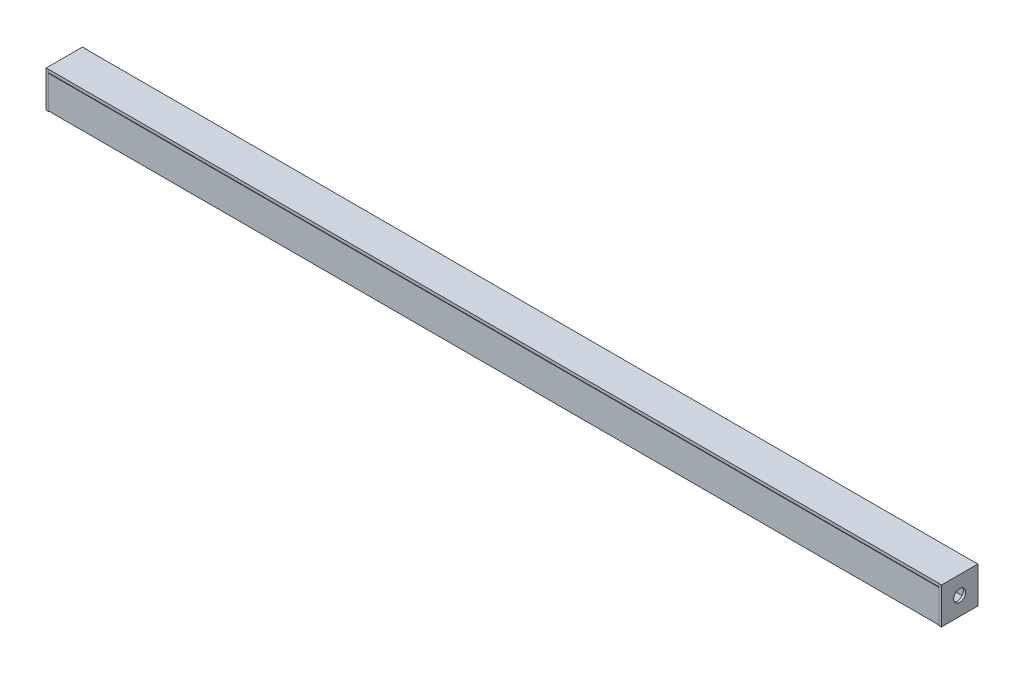
ISO-10303-21;
HEADER;
FILE_DESCRIPTION(('STEP AP214'),'2;1');
FILE_NAME('part.step','',(''),(''),'','','');
FILE_SCHEMA(('AUTOMOTIVE_DESIGN { 1 0 10303 214 1 1 1 1 }'));
ENDSEC;
DATA;
#1=APPLICATION_CONTEXT('core data for automotive mechanical design processes');
#2=APPLICATION_PROTOCOL_DEFINITION('international standard','automotive_design',2000,#1);
#3=PRODUCT_CONTEXT('',#1,'mechanical');
#4=PRODUCT('Part','Part','',(#3));
#5=PRODUCT_RELATED_PRODUCT_CATEGORY('part','',(#4));
#6=PRODUCT_DEFINITION_FORMATION('','',#4);
#7=PRODUCT_DEFINITION_CONTEXT('part definition',#1,'design');
#8=PRODUCT_DEFINITION('design','',#6,#7);
#9=PRODUCT_DEFINITION_SHAPE('','',#8);
#10=(LENGTH_UNIT() NAMED_UNIT(*) SI_UNIT(.MILLI.,.METRE.));
#11=(NAMED_UNIT(*) PLANE_ANGLE_UNIT() SI_UNIT($,.RADIAN.));
#12=(NAMED_UNIT(*) SI_UNIT($,.STERADIAN.) SOLID_ANGLE_UNIT());
#13=UNCERTAINTY_MEASURE_WITH_UNIT(LENGTH_MEASURE(1.E-05),#10,'distance_accuracy_value','');
#14=(GEOMETRIC_REPRESENTATION_CONTEXT(3) GLOBAL_UNCERTAINTY_ASSIGNED_CONTEXT((#13)) GLOBAL_UNIT_ASSIGNED_CONTEXT((#10,
#11,#12)) REPRESENTATION_CONTEXT('',''));
#15=CARTESIAN_POINT('',(0.,0.,0.));
#16=DIRECTION('',(0.,0.,1.));
#17=DIRECTION('',(1.,0.,0.));
#18=AXIS2_PLACEMENT_3D('',#15,#16,#17);
#19=CARTESIAN_POINT('',(372.,16.9427678417194,24.2571428571429));
#20=DIRECTION('',(0.,0.,-1.));
#21=DIRECTION('',(-1.,0.,0.));
#22=AXIS2_PLACEMENT_3D('',#19,#20,#21);
#23=PLANE('',#22);
#24=DIRECTION('',(0.,-1.,0.));
#25=VECTOR('',#24,1.);
#26=CARTESIAN_POINT('',(371.,16.9427678417194,24.2571428571429));
#27=LINE('',#26,#25);
#28=CARTESIAN_POINT('',(371.,16.9427678417194,24.2571428571429));
#29=VERTEX_POINT('',#28);
#30=CARTESIAN_POINT('',(371.,15.6881507608121,24.2571428571429));
#31=VERTEX_POINT('',#30);
#32=EDGE_CURVE('E359',#29,#31,#27,.T.);
#33=ORIENTED_EDGE('',*,*,#32,.F.);
#34=DIRECTION('',(-1.,0.,0.));
#35=VECTOR('',#34,1.);
#36=CARTESIAN_POINT('',(372.,16.9427678417194,24.2571428571429));
#37=LINE('',#36,#35);
#38=CARTESIAN_POINT('',(1.,16.9427678417194,24.2571428571429));
#39=VERTEX_POINT('',#38);
#40=EDGE_CURVE('E475',#29,#39,#37,.T.);
#41=ORIENTED_EDGE('',*,*,#40,.T.);
#42=DIRECTION('',(0.,1.,0.));
#43=VECTOR('',#42,1.);
#44=CARTESIAN_POINT('',(1.,16.9427678417194,24.2571428571429));
#45=LINE('',#44,#43);
#46=CARTESIAN_POINT('',(1.,15.6881507608121,24.2571428571429));
#47=VERTEX_POINT('',#46);
#48=EDGE_CURVE('E407',#47,#39,#45,.T.);
#49=ORIENTED_EDGE('',*,*,#48,.F.);
#50=DIRECTION('',(1.,0.,0.));
#51=VECTOR('',#50,1.);
#52=CARTESIAN_POINT('',(0.,15.6881507608121,24.2571428571429));
#53=LINE('',#52,#51);
#54=EDGE_CURVE('E471',#47,#31,#53,.T.);
#55=ORIENTED_EDGE('',*,*,#54,.T.);
#56=EDGE_LOOP('',(#33,#41,#49,#55));
#57=FACE_BOUND('',#56,.T.);
#58=ADVANCED_FACE('F39',(#57),#23,.F.);
#59=CARTESIAN_POINT('',(372.,16.9427678417194,9.25714285714286));
#60=DIRECTION('',(0.,0.,1.));
#61=DIRECTION('',(0.,-1.,0.));
#62=AXIS2_PLACEMENT_3D('',#59,#60,#61);
#63=PLANE('',#62);
#64=DIRECTION('',(0.,1.,0.));
#65=VECTOR('',#64,1.);
#66=CARTESIAN_POINT('',(371.,16.9427678417194,9.25714285714286));
#67=LINE('',#66,#65);
#68=CARTESIAN_POINT('',(371.,1.94276784171945,9.25714285714286));
#69=VERTEX_POINT('',#68);
#70=CARTESIAN_POINT('',(371.,15.4881507608121,9.25714285714286));
#71=VERTEX_POINT('',#70);
#72=EDGE_CURVE('E369',#69,#71,#67,.T.);
#73=ORIENTED_EDGE('',*,*,#72,.F.);
#74=DIRECTION('',(-1.,0.,0.));
#75=VECTOR('',#74,1.);
#76=CARTESIAN_POINT('',(372.,1.94276784171945,9.25714285714286));
#77=LINE('',#76,#75);
#78=CARTESIAN_POINT('',(1.,1.94276784171945,9.25714285714286));
#79=VERTEX_POINT('',#78);
#80=EDGE_CURVE('E47',#69,#79,#77,.T.);
#81=ORIENTED_EDGE('',*,*,#80,.T.);
#82=DIRECTION('',(0.,-1.,0.));
#83=VECTOR('',#82,1.);
#84=CARTESIAN_POINT('',(1.,16.9427678417194,9.25714285714286));
#85=LINE('',#84,#83);
#86=CARTESIAN_POINT('',(1.,15.4881507608121,9.25714285714286));
#87=VERTEX_POINT('',#86);
#88=EDGE_CURVE('E397',#87,#79,#85,.T.);
#89=ORIENTED_EDGE('',*,*,#88,.F.);
#90=DIRECTION('',(1.,0.,0.));
#91=VECTOR('',#90,1.);
#92=CARTESIAN_POINT('',(0.,15.4881507608121,9.25714285714286));
#93=LINE('',#92,#91);
#94=EDGE_CURVE('E488',#87,#71,#93,.T.);
#95=ORIENTED_EDGE('',*,*,#94,.T.);
#96=EDGE_LOOP('',(#73,#81,#89,#95));
#97=FACE_BOUND('',#96,.T.);
#98=ADVANCED_FACE('F510',(#97),#63,.F.);
#99=CARTESIAN_POINT('',(371.,15.4881507608121,24.2571428571429));
#100=VERTEX_POINT('',#99);
#101=CARTESIAN_POINT('',(371.,1.94276784171945,24.2571428571429));
#102=VERTEX_POINT('',#101);
#103=EDGE_CURVE('E348',#100,#102,#27,.T.);
#104=ORIENTED_EDGE('',*,*,#103,.F.);
#105=DIRECTION('',(1.,0.,0.));
#106=VECTOR('',#105,1.);
#107=CARTESIAN_POINT('',(0.,15.4881507608121,24.2571428571429));
#108=LINE('',#107,#106);
#109=CARTESIAN_POINT('',(1.,15.4881507608121,24.2571428571429));
#110=VERTEX_POINT('',#109);
#111=EDGE_CURVE('E484',#110,#100,#108,.T.);
#112=ORIENTED_EDGE('',*,*,#111,.F.);
#113=CARTESIAN_POINT('',(1.,1.94276784171945,24.2571428571429));
#114=VERTEX_POINT('',#113);
#115=EDGE_CURVE('E408',#114,#110,#45,.T.);
#116=ORIENTED_EDGE('',*,*,#115,.F.);
#117=DIRECTION('',(-1.,0.,0.));
#118=VECTOR('',#117,1.);
#119=CARTESIAN_POINT('',(372.,1.94276784171945,24.2571428571429));
#120=LINE('',#119,#118);
#121=EDGE_CURVE('E11',#102,#114,#120,.T.);
#122=ORIENTED_EDGE('',*,*,#121,.F.);
#123=EDGE_LOOP('',(#104,#112,#116,#122));
#124=FACE_BOUND('',#123,.T.);
#125=ADVANCED_FACE('F595',(#124),#23,.F.);
#126=CARTESIAN_POINT('',(372.,1.94276784171945,24.2571428571429));
#127=DIRECTION('',(0.,1.,0.));
#128=DIRECTION('',(0.,0.,1.));
#129=AXIS2_PLACEMENT_3D('',#126,#127,#128);
#130=PLANE('',#129);
#131=DIRECTION('',(0.,0.,-1.));
#132=VECTOR('',#131,1.);
#133=CARTESIAN_POINT('',(371.,1.94276784171945,24.2571428571429));
#134=LINE('',#133,#132);
#135=CARTESIAN_POINT('',(371.,1.94276784171945,23.2571428571429));
#136=VERTEX_POINT('',#135);
#137=EDGE_CURVE('E364',#102,#136,#134,.T.);
#138=ORIENTED_EDGE('',*,*,#137,.F.);
#139=ORIENTED_EDGE('',*,*,#121,.T.);
#140=DIRECTION('',(0.,0.,1.));
#141=VECTOR('',#140,1.);
#142=CARTESIAN_POINT('',(1.,1.94276784171945,9.25714285714286));
#143=LINE('',#142,#141);
#144=CARTESIAN_POINT('',(1.,1.94276784171945,23.2571428571429));
#145=VERTEX_POINT('',#144);
#146=EDGE_CURVE('E402',#145,#114,#143,.T.);
#147=ORIENTED_EDGE('',*,*,#146,.F.);
#148=DIRECTION('',(-1.,0.,0.));
#149=VECTOR('',#148,1.);
#150=CARTESIAN_POINT('',(1.,1.94276784171945,23.2571428571429));
#151=LINE('',#150,#149);
#152=EDGE_CURVE('E442',#136,#145,#151,.T.);
#153=ORIENTED_EDGE('',*,*,#152,.F.);
#154=EDGE_LOOP('',(#138,#139,#147,#153));
#155=FACE_BOUND('',#154,.T.);
#156=ADVANCED_FACE('F589',(#155),#130,.F.);
#157=CARTESIAN_POINT('',(371.,1.94276784171945,10.2571428571429));
#158=VERTEX_POINT('',#157);
#159=EDGE_CURVE('E363',#158,#69,#134,.T.);
#160=ORIENTED_EDGE('',*,*,#159,.F.);
#161=DIRECTION('',(1.,0.,0.));
#162=VECTOR('',#161,1.);
#163=CARTESIAN_POINT('',(1.,1.94276784171945,10.2571428571429));
#164=LINE('',#163,#162);
#165=CARTESIAN_POINT('',(1.,1.94276784171945,10.2571428571429));
#166=VERTEX_POINT('',#165);
#167=EDGE_CURVE('E436',#166,#158,#164,.T.);
#168=ORIENTED_EDGE('',*,*,#167,.F.);
#169=EDGE_CURVE('E403',#79,#166,#143,.T.);
#170=ORIENTED_EDGE('',*,*,#169,.F.);
#171=ORIENTED_EDGE('',*,*,#80,.F.);
#172=EDGE_LOOP('',(#160,#168,#170,#171));
#173=FACE_BOUND('',#172,.T.);
#174=ADVANCED_FACE('F516',(#173),#130,.F.);
#175=CARTESIAN_POINT('',(371.,15.6881507608121,9.25714285714286));
#176=VERTEX_POINT('',#175);
#177=CARTESIAN_POINT('',(371.,16.9427678417194,9.25714285714286));
#178=VERTEX_POINT('',#177);
#179=EDGE_CURVE('E368',#176,#178,#67,.T.);
#180=ORIENTED_EDGE('',*,*,#179,.F.);
#181=DIRECTION('',(1.,0.,0.));
#182=VECTOR('',#181,1.);
#183=CARTESIAN_POINT('',(0.,15.6881507608121,9.25714285714286));
#184=LINE('',#183,#182);
#185=CARTESIAN_POINT('',(1.,15.6881507608121,9.25714285714286));
#186=VERTEX_POINT('',#185);
#187=EDGE_CURVE('E461',#186,#176,#184,.T.);
#188=ORIENTED_EDGE('',*,*,#187,.F.);
#189=CARTESIAN_POINT('',(1.,16.9427678417194,9.25714285714286));
#190=VERTEX_POINT('',#189);
#191=EDGE_CURVE('E398',#190,#186,#85,.T.);
#192=ORIENTED_EDGE('',*,*,#191,.F.);
#193=DIRECTION('',(-1.,0.,0.));
#194=VECTOR('',#193,1.);
#195=CARTESIAN_POINT('',(372.,16.9427678417194,9.25714285714286));
#196=LINE('',#195,#194);
#197=EDGE_CURVE('E504',#178,#190,#196,.T.);
#198=ORIENTED_EDGE('',*,*,#197,.F.);
#199=EDGE_LOOP('',(#180,#188,#192,#198));
#200=FACE_BOUND('',#199,.T.);
#201=ADVANCED_FACE('F556',(#200),#63,.F.);
#202=CARTESIAN_POINT('',(372.,16.9427678417194,24.2571428571429));
#203=DIRECTION('',(0.,-1.,0.));
#204=DIRECTION('',(0.,0.,-1.));
#205=AXIS2_PLACEMENT_3D('',#202,#203,#204);
#206=PLANE('',#205);
#207=ORIENTED_EDGE('',*,*,#40,.F.);
#208=DIRECTION('',(0.,0.,1.));
#209=VECTOR('',#208,1.);
#210=CARTESIAN_POINT('',(371.,16.9427678417194,24.3571428571429));
#211=LINE('',#210,#209);
#212=CARTESIAN_POINT('',(371.,16.9427678417194,24.3571428571429));
#213=VERTEX_POINT('',#212);
#214=EDGE_CURVE('E294',#29,#213,#211,.T.);
#215=ORIENTED_EDGE('',*,*,#214,.T.);
#216=DIRECTION('',(-1.,0.,0.));
#217=VECTOR('',#216,1.);
#218=CARTESIAN_POINT('',(372.,16.9427678417194,24.3571428571429));
#219=LINE('',#218,#217);
#220=CARTESIAN_POINT('',(372.,16.9427678417194,24.3571428571429));
#221=VERTEX_POINT('',#220);
#222=EDGE_CURVE('E284',#221,#213,#219,.T.);
#223=ORIENTED_EDGE('',*,*,#222,.F.);
#224=DIRECTION('',(0.,0.,1.));
#225=VECTOR('',#224,1.);
#226=CARTESIAN_POINT('',(372.,16.9427678417194,24.3571428571429));
#227=LINE('',#226,#225);
#228=CARTESIAN_POINT('',(372.,16.9427678417194,9.15714285714286));
#229=VERTEX_POINT('',#228);
#230=EDGE_CURVE('E281',#229,#221,#227,.T.);
#231=ORIENTED_EDGE('',*,*,#230,.F.);
#232=DIRECTION('',(-1.,0.,0.));
#233=VECTOR('',#232,1.);
#234=CARTESIAN_POINT('',(372.,16.9427678417194,9.15714285714286));
#235=LINE('',#234,#233);
#236=CARTESIAN_POINT('',(371.,16.9427678417194,9.15714285714286));
#237=VERTEX_POINT('',#236);
#238=EDGE_CURVE('E301',#229,#237,#235,.T.);
#239=ORIENTED_EDGE('',*,*,#238,.T.);
#240=EDGE_CURVE('E275',#237,#178,#211,.T.);
#241=ORIENTED_EDGE('',*,*,#240,.T.);
#242=ORIENTED_EDGE('',*,*,#197,.T.);
#243=DIRECTION('',(0.,0.,-1.));
#244=VECTOR('',#243,1.);
#245=CARTESIAN_POINT('',(1.,16.9427678417194,9.15714285714286));
#246=LINE('',#245,#244);
#247=CARTESIAN_POINT('',(1.,16.9427678417194,9.15714285714286));
#248=VERTEX_POINT('',#247);
#249=EDGE_CURVE('E562',#190,#248,#246,.T.);
#250=ORIENTED_EDGE('',*,*,#249,.T.);
#251=DIRECTION('',(1.,0.,0.));
#252=VECTOR('',#251,1.);
#253=CARTESIAN_POINT('',(0.,16.9427678417194,9.15714285714286));
#254=LINE('',#253,#252);
#255=CARTESIAN_POINT('',(0.,16.9427678417194,9.15714285714286));
#256=VERTEX_POINT('',#255);
#257=EDGE_CURVE('E572',#256,#248,#254,.T.);
#258=ORIENTED_EDGE('',*,*,#257,.F.);
#259=DIRECTION('',(0.,0.,-1.));
#260=VECTOR('',#259,1.);
#261=CARTESIAN_POINT('',(0.,16.9427678417194,9.15714285714286));
#262=LINE('',#261,#260);
#263=CARTESIAN_POINT('',(0.,16.9427678417194,24.3571428571429));
#264=VERTEX_POINT('',#263);
#265=EDGE_CURVE('E244',#264,#256,#262,.T.);
#266=ORIENTED_EDGE('',*,*,#265,.F.);
#267=DIRECTION('',(1.,0.,0.));
#268=VECTOR('',#267,1.);
#269=CARTESIAN_POINT('',(0.,16.9427678417194,24.3571428571429));
#270=LINE('',#269,#268);
#271=CARTESIAN_POINT('',(1.,16.9427678417194,24.3571428571429));
#272=VERTEX_POINT('',#271);
#273=EDGE_CURVE('E262',#264,#272,#270,.T.);
#274=ORIENTED_EDGE('',*,*,#273,.T.);
#275=EDGE_CURVE('E249',#272,#39,#246,.T.);
#276=ORIENTED_EDGE('',*,*,#275,.T.);
#277=EDGE_LOOP('',(#207,#215,#223,#231,#239,#241,#242,#250,#258,#266,#274,#276));
#278=FACE_BOUND('',#277,.T.);
#279=ADVANCED_FACE('F533',(#278),#206,.F.);
#280=CARTESIAN_POINT('',(0.,15.4881507608121,9.25714285714286));
#281=DIRECTION('',(0.,-1.,0.));
#282=DIRECTION('',(0.,0.,-1.));
#283=AXIS2_PLACEMENT_3D('',#280,#281,#282);
#284=PLANE('',#283);
#285=DIRECTION('',(0.,0.,1.));
#286=VECTOR('',#285,1.);
#287=CARTESIAN_POINT('',(371.,15.4881507608121,9.25714285714286));
#288=LINE('',#287,#286);
#289=CARTESIAN_POINT('',(371.,15.4881507608121,9.45714285714286));
#290=VERTEX_POINT('',#289);
#291=EDGE_CURVE('E393',#71,#290,#288,.T.);
#292=ORIENTED_EDGE('',*,*,#291,.F.);
#293=ORIENTED_EDGE('',*,*,#94,.F.);
#294=DIRECTION('',(0.,0.,-1.));
#295=VECTOR('',#294,1.);
#296=CARTESIAN_POINT('',(1.,15.4881507608121,9.25714285714286));
#297=LINE('',#296,#295);
#298=CARTESIAN_POINT('',(1.,15.4881507608121,9.45714285714286));
#299=VERTEX_POINT('',#298);
#300=EDGE_CURVE('E432',#299,#87,#297,.T.);
#301=ORIENTED_EDGE('',*,*,#300,.F.);
#302=DIRECTION('',(1.,0.,0.));
#303=VECTOR('',#302,1.);
#304=CARTESIAN_POINT('',(0.,15.4881507608121,9.45714285714286));
#305=LINE('',#304,#303);
#306=EDGE_CURVE('E491',#299,#290,#305,.T.);
#307=ORIENTED_EDGE('',*,*,#306,.T.);
#308=EDGE_LOOP('',(#292,#293,#301,#307));
#309=FACE_BOUND('',#308,.T.);
#310=ADVANCED_FACE('F620',(#309),#284,.F.);
#311=CARTESIAN_POINT('',(0.,15.6881507608121,9.45714285714286));
#312=DIRECTION('',(0.,0.,1.));
#313=DIRECTION('',(1.,0.,0.));
#314=AXIS2_PLACEMENT_3D('',#311,#312,#313);
#315=PLANE('',#314);
#316=DIRECTION('',(0.,1.,0.));
#317=VECTOR('',#316,1.);
#318=CARTESIAN_POINT('',(371.,15.6881507608121,9.45714285714286));
#319=LINE('',#318,#317);
#320=CARTESIAN_POINT('',(371.,15.6881507608121,9.45714285714286));
#321=VERTEX_POINT('',#320);
#322=EDGE_CURVE('E389',#290,#321,#319,.T.);
#323=ORIENTED_EDGE('',*,*,#322,.F.);
#324=ORIENTED_EDGE('',*,*,#306,.F.);
#325=DIRECTION('',(0.,-1.,0.));
#326=VECTOR('',#325,1.);
#327=CARTESIAN_POINT('',(1.,15.6881507608121,9.45714285714286));
#328=LINE('',#327,#326);
#329=CARTESIAN_POINT('',(1.,15.6881507608121,9.45714285714286));
#330=VERTEX_POINT('',#329);
#331=EDGE_CURVE('E428',#330,#299,#328,.T.);
#332=ORIENTED_EDGE('',*,*,#331,.F.);
#333=DIRECTION('',(1.,0.,0.));
#334=VECTOR('',#333,1.);
#335=CARTESIAN_POINT('',(0.,15.6881507608121,9.45714285714286));
#336=LINE('',#335,#334);
#337=EDGE_CURVE('E495',#330,#321,#336,.T.);
#338=ORIENTED_EDGE('',*,*,#337,.T.);
#339=EDGE_LOOP('',(#323,#324,#332,#338));
#340=FACE_BOUND('',#339,.T.);
#341=ADVANCED_FACE('F623',(#340),#315,.F.);
#342=CARTESIAN_POINT('',(0.,15.6881507608121,9.25714285714286));
#343=DIRECTION('',(0.,1.,0.));
#344=DIRECTION('',(0.,0.,1.));
#345=AXIS2_PLACEMENT_3D('',#342,#343,#344);
#346=PLANE('',#345);
#347=DIRECTION('',(0.,0.,-1.));
#348=VECTOR('',#347,1.);
#349=CARTESIAN_POINT('',(371.,15.6881507608121,9.25714285714286));
#350=LINE('',#349,#348);
#351=EDGE_CURVE('E385',#321,#176,#350,.T.);
#352=ORIENTED_EDGE('',*,*,#351,.F.);
#353=ORIENTED_EDGE('',*,*,#337,.F.);
#354=DIRECTION('',(0.,0.,1.));
#355=VECTOR('',#354,1.);
#356=CARTESIAN_POINT('',(1.,15.6881507608121,9.25714285714286));
#357=LINE('',#356,#355);
#358=EDGE_CURVE('E424',#186,#330,#357,.T.);
#359=ORIENTED_EDGE('',*,*,#358,.F.);
#360=ORIENTED_EDGE('',*,*,#187,.T.);
#361=EDGE_LOOP('',(#352,#353,#359,#360));
#362=FACE_BOUND('',#361,.T.);
#363=ADVANCED_FACE('F559',(#362),#346,.F.);
#364=CARTESIAN_POINT('',(0.,15.6881507608121,24.2571428571429));
#365=DIRECTION('',(0.,1.,0.));
#366=DIRECTION('',(0.,0.,1.));
#367=AXIS2_PLACEMENT_3D('',#364,#365,#366);
#368=PLANE('',#367);
#369=DIRECTION('',(0.,0.,-1.));
#370=VECTOR('',#369,1.);
#371=CARTESIAN_POINT('',(371.,15.6881507608121,24.2571428571429));
#372=LINE('',#371,#370);
#373=CARTESIAN_POINT('',(371.,15.6881507608121,24.0571428571429));
#374=VERTEX_POINT('',#373);
#375=EDGE_CURVE('E381',#31,#374,#372,.T.);
#376=ORIENTED_EDGE('',*,*,#375,.F.);
#377=ORIENTED_EDGE('',*,*,#54,.F.);
#378=DIRECTION('',(0.,0.,1.));
#379=VECTOR('',#378,1.);
#380=CARTESIAN_POINT('',(1.,15.6881507608121,24.2571428571429));
#381=LINE('',#380,#379);
#382=CARTESIAN_POINT('',(1.,15.6881507608121,24.0571428571429));
#383=VERTEX_POINT('',#382);
#384=EDGE_CURVE('E420',#383,#47,#381,.T.);
#385=ORIENTED_EDGE('',*,*,#384,.F.);
#386=DIRECTION('',(1.,0.,0.));
#387=VECTOR('',#386,1.);
#388=CARTESIAN_POINT('',(0.,15.6881507608121,24.0571428571429));
#389=LINE('',#388,#387);
#390=EDGE_CURVE('E476',#383,#374,#389,.T.);
#391=ORIENTED_EDGE('',*,*,#390,.T.);
#392=EDGE_LOOP('',(#376,#377,#385,#391));
#393=FACE_BOUND('',#392,.T.);
#394=ADVANCED_FACE('F604',(#393),#368,.F.);
#395=CARTESIAN_POINT('',(0.,15.6881507608121,24.0571428571429));
#396=DIRECTION('',(0.,0.,-1.));
#397=DIRECTION('',(-1.,0.,0.));
#398=AXIS2_PLACEMENT_3D('',#395,#396,#397);
#399=PLANE('',#398);
#400=DIRECTION('',(0.,-1.,0.));
#401=VECTOR('',#400,1.);
#402=CARTESIAN_POINT('',(371.,15.6881507608121,24.0571428571429));
#403=LINE('',#402,#401);
#404=CARTESIAN_POINT('',(371.,15.4881507608121,24.0571428571429));
#405=VERTEX_POINT('',#404);
#406=EDGE_CURVE('E377',#374,#405,#403,.T.);
#407=ORIENTED_EDGE('',*,*,#406,.F.);
#408=ORIENTED_EDGE('',*,*,#390,.F.);
#409=DIRECTION('',(0.,1.,0.));
#410=VECTOR('',#409,1.);
#411=CARTESIAN_POINT('',(1.,15.6881507608121,24.0571428571429));
#412=LINE('',#411,#410);
#413=CARTESIAN_POINT('',(1.,15.4881507608121,24.0571428571429));
#414=VERTEX_POINT('',#413);
#415=EDGE_CURVE('E416',#414,#383,#412,.T.);
#416=ORIENTED_EDGE('',*,*,#415,.F.);
#417=DIRECTION('',(1.,0.,0.));
#418=VECTOR('',#417,1.);
#419=CARTESIAN_POINT('',(0.,15.4881507608121,24.0571428571429));
#420=LINE('',#419,#418);
#421=EDGE_CURVE('E480',#414,#405,#420,.T.);
#422=ORIENTED_EDGE('',*,*,#421,.T.);
#423=EDGE_LOOP('',(#407,#408,#416,#422));
#424=FACE_BOUND('',#423,.T.);
#425=ADVANCED_FACE('F602',(#424),#399,.F.);
#426=CARTESIAN_POINT('',(0.,15.4881507608121,24.2571428571429));
#427=DIRECTION('',(0.,-1.,0.));
#428=DIRECTION('',(0.,0.,-1.));
#429=AXIS2_PLACEMENT_3D('',#426,#427,#428);
#430=PLANE('',#429);
#431=DIRECTION('',(0.,0.,1.));
#432=VECTOR('',#431,1.);
#433=CARTESIAN_POINT('',(371.,15.4881507608121,24.2571428571429));
#434=LINE('',#433,#432);
#435=EDGE_CURVE('E373',#405,#100,#434,.T.);
#436=ORIENTED_EDGE('',*,*,#435,.F.);
#437=ORIENTED_EDGE('',*,*,#421,.F.);
#438=DIRECTION('',(0.,0.,-1.));
#439=VECTOR('',#438,1.);
#440=CARTESIAN_POINT('',(1.,15.4881507608121,24.2571428571429));
#441=LINE('',#440,#439);
#442=EDGE_CURVE('E412',#110,#414,#441,.T.);
#443=ORIENTED_EDGE('',*,*,#442,.F.);
#444=ORIENTED_EDGE('',*,*,#111,.T.);
#445=EDGE_LOOP('',(#436,#437,#443,#444));
#446=FACE_BOUND('',#445,.T.);
#447=ADVANCED_FACE('F598',(#446),#430,.F.);
#448=CARTESIAN_POINT('',(1.,2.94276784171945,23.2571428571429));
#449=DIRECTION('',(0.,0.,1.));
#450=DIRECTION('',(1.,0.,0.));
#451=AXIS2_PLACEMENT_3D('',#448,#449,#450);
#452=PLANE('',#451);
#453=ORIENTED_EDGE('',*,*,#152,.T.);
#454=DIRECTION('',(0.,-1.,0.));
#455=VECTOR('',#454,1.);
#456=CARTESIAN_POINT('',(1.,2.94276784171945,23.2571428571429));
#457=LINE('',#456,#455);
#458=CARTESIAN_POINT('',(1.,2.94276784171945,23.2571428571429));
#459=VERTEX_POINT('',#458);
#460=EDGE_CURVE('E457',#459,#145,#457,.T.);
#461=ORIENTED_EDGE('',*,*,#460,.F.);
#462=DIRECTION('',(-1.,0.,0.));
#463=VECTOR('',#462,1.);
#464=CARTESIAN_POINT('',(1.,2.94276784171945,23.2571428571429));
#465=LINE('',#464,#463);
#466=CARTESIAN_POINT('',(371.,2.94276784171945,23.2571428571429));
#467=VERTEX_POINT('',#466);
#468=EDGE_CURVE('E447',#467,#459,#465,.T.);
#469=ORIENTED_EDGE('',*,*,#468,.F.);
#470=DIRECTION('',(0.,-1.,0.));
#471=VECTOR('',#470,1.);
#472=CARTESIAN_POINT('',(371.,2.94276784171945,23.2571428571429));
#473=LINE('',#472,#471);
#474=EDGE_CURVE('E462',#467,#136,#473,.T.);
#475=ORIENTED_EDGE('',*,*,#474,.T.);
#476=EDGE_LOOP('',(#453,#461,#469,#475));
#477=FACE_BOUND('',#476,.T.);
#478=ADVANCED_FACE('F592',(#477),#452,.F.);
#479=CARTESIAN_POINT('',(1.,2.94276784171945,10.2571428571429));
#480=DIRECTION('',(0.,0.,-1.));
#481=DIRECTION('',(-1.,0.,0.));
#482=AXIS2_PLACEMENT_3D('',#479,#480,#481);
#483=PLANE('',#482);
#484=ORIENTED_EDGE('',*,*,#167,.T.);
#485=DIRECTION('',(0.,-1.,0.));
#486=VECTOR('',#485,1.);
#487=CARTESIAN_POINT('',(371.,2.94276784171945,10.2571428571429));
#488=LINE('',#487,#486);
#489=CARTESIAN_POINT('',(371.,2.94276784171945,10.2571428571429));
#490=VERTEX_POINT('',#489);
#491=EDGE_CURVE('E465',#490,#158,#488,.T.);
#492=ORIENTED_EDGE('',*,*,#491,.F.);
#493=DIRECTION('',(1.,0.,0.));
#494=VECTOR('',#493,1.);
#495=CARTESIAN_POINT('',(1.,2.94276784171945,10.2571428571429));
#496=LINE('',#495,#494);
#497=CARTESIAN_POINT('',(1.,2.94276784171945,10.2571428571429));
#498=VERTEX_POINT('',#497);
#499=EDGE_CURVE('E441',#498,#490,#496,.T.);
#500=ORIENTED_EDGE('',*,*,#499,.F.);
#501=DIRECTION('',(0.,-1.,0.));
#502=VECTOR('',#501,1.);
#503=CARTESIAN_POINT('',(1.,2.94276784171945,10.2571428571429));
#504=LINE('',#503,#502);
#505=EDGE_CURVE('E450',#498,#166,#504,.T.);
#506=ORIENTED_EDGE('',*,*,#505,.T.);
#507=EDGE_LOOP('',(#484,#492,#500,#506));
#508=FACE_BOUND('',#507,.T.);
#509=ADVANCED_FACE('F636',(#508),#483,.F.);
#510=CARTESIAN_POINT('',(0.,2.94276784171945,0.));
#511=DIRECTION('',(0.,-1.,0.));
#512=DIRECTION('',(0.,0.,-1.));
#513=AXIS2_PLACEMENT_3D('',#510,#511,#512);
#514=PLANE('',#513);
#515=DIRECTION('',(0.,0.,-1.));
#516=VECTOR('',#515,1.);
#517=CARTESIAN_POINT('',(1.,2.94276784171945,23.2571428571429));
#518=LINE('',#517,#516);
#519=EDGE_CURVE('E437',#459,#498,#518,.T.);
#520=ORIENTED_EDGE('',*,*,#519,.T.);
#521=ORIENTED_EDGE('',*,*,#499,.T.);
#522=DIRECTION('',(0.,0.,1.));
#523=VECTOR('',#522,1.);
#524=CARTESIAN_POINT('',(371.,2.94276784171945,23.2571428571429));
#525=LINE('',#524,#523);
#526=EDGE_CURVE('E62',#490,#467,#525,.T.);
#527=ORIENTED_EDGE('',*,*,#526,.T.);
#528=ORIENTED_EDGE('',*,*,#468,.T.);
#529=EDGE_LOOP('',(#520,#521,#527,#528));
#530=FACE_BOUND('',#529,.T.);
#531=ADVANCED_FACE('F639',(#530),#514,.T.);
#532=CARTESIAN_POINT('',(1.,14.9427678417194,23.0571428571429));
#533=DIRECTION('',(0.,0.,1.));
#534=DIRECTION('',(1.,0.,0.));
#535=AXIS2_PLACEMENT_3D('',#532,#533,#534);
#536=PLANE('',#535);
#537=DIRECTION('',(0.,-1.,0.));
#538=VECTOR('',#537,1.);
#539=CARTESIAN_POINT('',(371.,14.9427678417194,23.0571428571429));
#540=LINE('',#539,#538);
#541=CARTESIAN_POINT('',(371.,14.9427678417194,23.0571428571429));
#542=VERTEX_POINT('',#541);
#543=CARTESIAN_POINT('',(371.,3.54375537329242,23.0571428571429));
#544=VERTEX_POINT('',#543);
#545=EDGE_CURVE('E313',#542,#544,#540,.T.);
#546=ORIENTED_EDGE('',*,*,#545,.T.);
#547=DIRECTION('',(1.,0.,0.));
#548=VECTOR('',#547,1.);
#549=CARTESIAN_POINT('',(1.,3.54375537329242,23.0571428571429));
#550=LINE('',#549,#548);
#551=CARTESIAN_POINT('',(1.,3.54375537329242,23.0571428571429));
#552=VERTEX_POINT('',#551);
#553=EDGE_CURVE('E329',#552,#544,#550,.T.);
#554=ORIENTED_EDGE('',*,*,#553,.F.);
#555=DIRECTION('',(0.,-1.,0.));
#556=VECTOR('',#555,1.);
#557=CARTESIAN_POINT('',(1.,14.9427678417194,23.0571428571429));
#558=LINE('',#557,#556);
#559=CARTESIAN_POINT('',(1.,14.9427678417194,23.0571428571429));
#560=VERTEX_POINT('',#559);
#561=EDGE_CURVE('E314',#560,#552,#558,.T.);
#562=ORIENTED_EDGE('',*,*,#561,.F.);
#563=DIRECTION('',(1.,0.,0.));
#564=VECTOR('',#563,1.);
#565=CARTESIAN_POINT('',(1.,14.9427678417194,23.0571428571429));
#566=LINE('',#565,#564);
#567=EDGE_CURVE('E344',#560,#542,#566,.T.);
#568=ORIENTED_EDGE('',*,*,#567,.T.);
#569=EDGE_LOOP('',(#546,#554,#562,#568));
#570=FACE_BOUND('',#569,.T.);
#571=ADVANCED_FACE('F645',(#570),#536,.F.);
#572=CARTESIAN_POINT('',(1.,14.9427678417194,23.0571428571429));
#573=DIRECTION('',(0.,1.,0.));
#574=DIRECTION('',(0.,0.,1.));
#575=AXIS2_PLACEMENT_3D('',#572,#573,#574);
#576=PLANE('',#575);
#577=DIRECTION('',(0.,0.,1.));
#578=VECTOR('',#577,1.);
#579=CARTESIAN_POINT('',(371.,14.9427678417194,23.0571428571429));
#580=LINE('',#579,#578);
#581=CARTESIAN_POINT('',(371.,14.9427678417194,10.4571428571429));
#582=VERTEX_POINT('',#581);
#583=EDGE_CURVE('E319',#582,#542,#580,.T.);
#584=ORIENTED_EDGE('',*,*,#583,.T.);
#585=ORIENTED_EDGE('',*,*,#567,.F.);
#586=DIRECTION('',(0.,0.,1.));
#587=VECTOR('',#586,1.);
#588=CARTESIAN_POINT('',(1.,14.9427678417194,23.0571428571429));
#589=LINE('',#588,#587);
#590=CARTESIAN_POINT('',(1.,14.9427678417194,10.4571428571429));
#591=VERTEX_POINT('',#590);
#592=EDGE_CURVE('E325',#591,#560,#589,.T.);
#593=ORIENTED_EDGE('',*,*,#592,.F.);
#594=DIRECTION('',(1.,0.,0.));
#595=VECTOR('',#594,1.);
#596=CARTESIAN_POINT('',(1.,14.9427678417194,10.4571428571429));
#597=LINE('',#596,#595);
#598=EDGE_CURVE('E349',#591,#582,#597,.T.);
#599=ORIENTED_EDGE('',*,*,#598,.T.);
#600=EDGE_LOOP('',(#584,#585,#593,#599));
#601=FACE_BOUND('',#600,.T.);
#602=ADVANCED_FACE('F648',(#601),#576,.F.);
#603=CARTESIAN_POINT('',(1.,14.9427678417194,10.4571428571429));
#604=DIRECTION('',(0.,0.,-1.));
#605=DIRECTION('',(0.,1.,0.));
#606=AXIS2_PLACEMENT_3D('',#603,#604,#605);
#607=PLANE('',#606);
#608=DIRECTION('',(0.,1.,0.));
#609=VECTOR('',#608,1.);
#610=CARTESIAN_POINT('',(371.,14.9427678417194,10.4571428571429));
#611=LINE('',#610,#609);
#612=CARTESIAN_POINT('',(371.,3.54375537329242,10.4571428571429));
#613=VERTEX_POINT('',#612);
#614=EDGE_CURVE('E337',#613,#582,#611,.T.);
#615=ORIENTED_EDGE('',*,*,#614,.T.);
#616=ORIENTED_EDGE('',*,*,#598,.F.);
#617=DIRECTION('',(0.,1.,0.));
#618=VECTOR('',#617,1.);
#619=CARTESIAN_POINT('',(1.,14.9427678417194,10.4571428571429));
#620=LINE('',#619,#618);
#621=CARTESIAN_POINT('',(1.,3.54375537329242,10.4571428571429));
#622=VERTEX_POINT('',#621);
#623=EDGE_CURVE('E54',#622,#591,#620,.T.);
#624=ORIENTED_EDGE('',*,*,#623,.F.);
#625=DIRECTION('',(1.,0.,0.));
#626=VECTOR('',#625,1.);
#627=CARTESIAN_POINT('',(1.,3.54375537329242,10.4571428571429));
#628=LINE('',#627,#626);
#629=EDGE_CURVE('E353',#622,#613,#628,.T.);
#630=ORIENTED_EDGE('',*,*,#629,.T.);
#631=EDGE_LOOP('',(#615,#616,#624,#630));
#632=FACE_BOUND('',#631,.T.);
#633=ADVANCED_FACE('F653',(#632),#607,.F.);
#634=CARTESIAN_POINT('',(1.,3.54375537329242,23.0571428571429));
#635=DIRECTION('',(0.,-1.,0.));
#636=DIRECTION('',(0.,0.,-1.));
#637=AXIS2_PLACEMENT_3D('',#634,#635,#636);
#638=PLANE('',#637);
#639=DIRECTION('',(0.,0.,-1.));
#640=VECTOR('',#639,1.);
#641=CARTESIAN_POINT('',(371.,3.54375537329242,23.0571428571429));
#642=LINE('',#641,#640);
#643=EDGE_CURVE('E333',#544,#613,#642,.T.);
#644=ORIENTED_EDGE('',*,*,#643,.T.);
#645=ORIENTED_EDGE('',*,*,#629,.F.);
#646=DIRECTION('',(0.,0.,-1.));
#647=VECTOR('',#646,1.);
#648=CARTESIAN_POINT('',(1.,3.54375537329242,23.0571428571429));
#649=LINE('',#648,#647);
#650=EDGE_CURVE('E318',#552,#622,#649,.T.);
#651=ORIENTED_EDGE('',*,*,#650,.F.);
#652=ORIENTED_EDGE('',*,*,#553,.T.);
#653=EDGE_LOOP('',(#644,#645,#651,#652));
#654=FACE_BOUND('',#653,.T.);
#655=ADVANCED_FACE('F650',(#654),#638,.F.);
#656=CARTESIAN_POINT('',(371.,0.,0.));
#657=DIRECTION('',(1.,0.,0.));
#658=DIRECTION('',(0.,0.,-1.));
#659=AXIS2_PLACEMENT_3D('',#656,#657,#658);
#660=PLANE('',#659);
#661=ORIENTED_EDGE('',*,*,#351,.T.);
#662=ORIENTED_EDGE('',*,*,#179,.T.);
#663=ORIENTED_EDGE('',*,*,#240,.F.);
#664=DIRECTION('',(0.,1.,0.));
#665=VECTOR('',#664,1.);
#666=CARTESIAN_POINT('',(371.,16.9427678417194,9.15714285714286));
#667=LINE('',#666,#665);
#668=CARTESIAN_POINT('',(371.,1.84276784171945,9.15714285714285));
#669=VERTEX_POINT('',#668);
#670=EDGE_CURVE('E291',#669,#237,#667,.T.);
#671=ORIENTED_EDGE('',*,*,#670,.F.);
#672=DIRECTION('',(0.,0.,-1.));
#673=VECTOR('',#672,1.);
#674=CARTESIAN_POINT('',(371.,1.84276784171945,24.3571428571429));
#675=LINE('',#674,#673);
#676=CARTESIAN_POINT('',(371.,1.84276784171945,24.3571428571429));
#677=VERTEX_POINT('',#676);
#678=EDGE_CURVE('E288',#677,#669,#675,.T.);
#679=ORIENTED_EDGE('',*,*,#678,.F.);
#680=DIRECTION('',(0.,-1.,0.));
#681=VECTOR('',#680,1.);
#682=CARTESIAN_POINT('',(371.,16.9427678417194,24.3571428571429));
#683=LINE('',#682,#681);
#684=EDGE_CURVE('E268',#213,#677,#683,.T.);
#685=ORIENTED_EDGE('',*,*,#684,.F.);
#686=ORIENTED_EDGE('',*,*,#214,.F.);
#687=ORIENTED_EDGE('',*,*,#32,.T.);
#688=ORIENTED_EDGE('',*,*,#375,.T.);
#689=ORIENTED_EDGE('',*,*,#406,.T.);
#690=ORIENTED_EDGE('',*,*,#435,.T.);
#691=ORIENTED_EDGE('',*,*,#103,.T.);
#692=ORIENTED_EDGE('',*,*,#137,.T.);
#693=ORIENTED_EDGE('',*,*,#474,.F.);
#694=ORIENTED_EDGE('',*,*,#526,.F.);
#695=ORIENTED_EDGE('',*,*,#491,.T.);
#696=ORIENTED_EDGE('',*,*,#159,.T.);
#697=ORIENTED_EDGE('',*,*,#72,.T.);
#698=ORIENTED_EDGE('',*,*,#291,.T.);
#699=ORIENTED_EDGE('',*,*,#322,.T.);
#700=EDGE_LOOP('',(#661,#662,#663,#671,#679,#685,#686,#687,#688,#689,#690,#691,#692,#693,#694,
#695,#696,#697,#698,#699));
#701=FACE_BOUND('',#700,.T.);
#702=ADVANCED_FACE('F542',(#701),#660,.F.);
#703=CARTESIAN_POINT('',(372.,0.,0.));
#704=DIRECTION('',(1.,0.,0.));
#705=DIRECTION('',(0.,0.,-1.));
#706=AXIS2_PLACEMENT_3D('',#703,#704,#705);
#707=PLANE('',#706);
#708=DIRECTION('',(0.,-1.,0.));
#709=VECTOR('',#708,1.);
#710=CARTESIAN_POINT('',(372.,16.9427678417194,24.3571428571429));
#711=LINE('',#710,#709);
#712=CARTESIAN_POINT('',(372.,1.84276784171945,24.3571428571429));
#713=VERTEX_POINT('',#712);
#714=EDGE_CURVE('E270',#221,#713,#711,.T.);
#715=ORIENTED_EDGE('',*,*,#714,.T.);
#716=DIRECTION('',(0.,0.,-1.));
#717=VECTOR('',#716,1.);
#718=CARTESIAN_POINT('',(372.,1.84276784171945,24.3571428571429));
#719=LINE('',#718,#717);
#720=CARTESIAN_POINT('',(372.,1.84276784171945,9.15714285714285));
#721=VERTEX_POINT('',#720);
#722=EDGE_CURVE('E274',#713,#721,#719,.T.);
#723=ORIENTED_EDGE('',*,*,#722,.T.);
#724=DIRECTION('',(0.,1.,0.));
#725=VECTOR('',#724,1.);
#726=CARTESIAN_POINT('',(372.,16.9427678417194,9.15714285714286));
#727=LINE('',#726,#725);
#728=EDGE_CURVE('E278',#721,#229,#727,.T.);
#729=ORIENTED_EDGE('',*,*,#728,.T.);
#730=ORIENTED_EDGE('',*,*,#230,.T.);
#731=EDGE_LOOP('',(#715,#723,#729,#730));
#732=FACE_BOUND('',#731,.T.);
#733=CARTESIAN_POINT('',(372.,9.39276784171945,16.7571428571429));
#734=DIRECTION('',(1.,0.,0.));
#735=DIRECTION('',(0.,0.,-1.));
#736=AXIS2_PLACEMENT_3D('',#733,#734,#735);
#737=CIRCLE('',#736,2.5);
#738=CARTESIAN_POINT('',(372.,9.39276784171945,14.2571428571429));
#739=VERTEX_POINT('',#738);
#740=EDGE_CURVE('E260',#739,#739,#737,.T.);
#741=ORIENTED_EDGE('',*,*,#740,.F.);
#742=EDGE_LOOP('',(#741));
#743=FACE_BOUND('',#742,.T.);
#744=ADVANCED_FACE('F550',(#732,#743),#707,.T.);
#745=ORIENTED_EDGE('',*,*,#545,.F.);
#746=ORIENTED_EDGE('',*,*,#583,.F.);
#747=ORIENTED_EDGE('',*,*,#614,.F.);
#748=ORIENTED_EDGE('',*,*,#643,.F.);
#749=EDGE_LOOP('',(#745,#746,#747,#748));
#750=FACE_BOUND('',#749,.T.);
#751=CARTESIAN_POINT('',(371.,9.39276784171945,16.7571428571429));
#752=DIRECTION('',(1.,0.,0.));
#753=DIRECTION('',(0.,0.,-1.));
#754=AXIS2_PLACEMENT_3D('',#751,#752,#753);
#755=CIRCLE('',#754,2.5);
#756=CARTESIAN_POINT('',(371.,9.39276784171945,14.2571428571429));
#757=VERTEX_POINT('',#756);
#758=EDGE_CURVE('E255',#757,#757,#755,.T.);
#759=ORIENTED_EDGE('',*,*,#758,.T.);
#760=EDGE_LOOP('',(#759));
#761=FACE_BOUND('',#760,.T.);
#762=ADVANCED_FACE('F662',(#750,#761),#660,.F.);
#763=CARTESIAN_POINT('',(372.,16.9427678417194,24.3571428571429));
#764=DIRECTION('',(0.,0.,-1.));
#765=DIRECTION('',(0.,1.,0.));
#766=AXIS2_PLACEMENT_3D('',#763,#764,#765);
#767=PLANE('',#766);
#768=ORIENTED_EDGE('',*,*,#684,.T.);
#769=DIRECTION('',(-1.,0.,0.));
#770=VECTOR('',#769,1.);
#771=CARTESIAN_POINT('',(372.,1.84276784171945,24.3571428571429));
#772=LINE('',#771,#770);
#773=EDGE_CURVE('E309',#713,#677,#772,.T.);
#774=ORIENTED_EDGE('',*,*,#773,.F.);
#775=ORIENTED_EDGE('',*,*,#714,.F.);
#776=ORIENTED_EDGE('',*,*,#222,.T.);
#777=EDGE_LOOP('',(#768,#774,#775,#776));
#778=FACE_BOUND('',#777,.T.);
#779=ADVANCED_FACE('F540',(#778),#767,.F.);
#780=CARTESIAN_POINT('',(372.,1.84276784171945,24.3571428571429));
#781=DIRECTION('',(0.,1.,0.));
#782=DIRECTION('',(0.,0.,1.));
#783=AXIS2_PLACEMENT_3D('',#780,#781,#782);
#784=PLANE('',#783);
#785=ORIENTED_EDGE('',*,*,#678,.T.);
#786=DIRECTION('',(-1.,0.,0.));
#787=VECTOR('',#786,1.);
#788=CARTESIAN_POINT('',(372.,1.84276784171945,9.15714285714285));
#789=LINE('',#788,#787);
#790=EDGE_CURVE('E305',#721,#669,#789,.T.);
#791=ORIENTED_EDGE('',*,*,#790,.F.);
#792=ORIENTED_EDGE('',*,*,#722,.F.);
#793=ORIENTED_EDGE('',*,*,#773,.T.);
#794=EDGE_LOOP('',(#785,#791,#792,#793));
#795=FACE_BOUND('',#794,.T.);
#796=ADVANCED_FACE('F547',(#795),#784,.F.);
#797=CARTESIAN_POINT('',(372.,16.9427678417194,9.15714285714286));
#798=DIRECTION('',(0.,0.,1.));
#799=DIRECTION('',(0.,-1.,0.));
#800=AXIS2_PLACEMENT_3D('',#797,#798,#799);
#801=PLANE('',#800);
#802=ORIENTED_EDGE('',*,*,#670,.T.);
#803=ORIENTED_EDGE('',*,*,#238,.F.);
#804=ORIENTED_EDGE('',*,*,#728,.F.);
#805=ORIENTED_EDGE('',*,*,#790,.T.);
#806=EDGE_LOOP('',(#802,#803,#804,#805));
#807=FACE_BOUND('',#806,.T.);
#808=ADVANCED_FACE('F665',(#807),#801,.F.);
#809=CARTESIAN_POINT('',(372.,9.39276784171945,16.7571428571429));
#810=DIRECTION('',(-1.,0.,0.));
#811=DIRECTION('',(0.,0.,1.));
#812=AXIS2_PLACEMENT_3D('',#809,#810,#811);
#813=CYLINDRICAL_SURFACE('',#812,2.5);
#814=ORIENTED_EDGE('',*,*,#740,.T.);
#815=EDGE_LOOP('',(#814));
#816=FACE_BOUND('',#815,.T.);
#817=ORIENTED_EDGE('',*,*,#758,.F.);
#818=EDGE_LOOP('',(#817));
#819=FACE_BOUND('',#818,.T.);
#820=ADVANCED_FACE('F668',(#816,#819),#813,.F.);
#821=CARTESIAN_POINT('',(1.,0.,0.));
#822=DIRECTION('',(-1.,0.,0.));
#823=DIRECTION('',(0.,0.,1.));
#824=AXIS2_PLACEMENT_3D('',#821,#822,#823);
#825=PLANE('',#824);
#826=CARTESIAN_POINT('',(1.,9.39276784171945,16.7571428571429));
#827=DIRECTION('',(-1.,0.,0.));
#828=DIRECTION('',(0.,0.,1.));
#829=AXIS2_PLACEMENT_3D('',#826,#827,#828);
#830=CIRCLE('',#829,2.5);
#831=CARTESIAN_POINT('',(1.,9.39276784171945,19.2571428571429));
#832=VERTEX_POINT('',#831);
#833=EDGE_CURVE('E701',#832,#832,#830,.T.);
#834=ORIENTED_EDGE('',*,*,#833,.T.);
#835=EDGE_LOOP('',(#834));
#836=FACE_BOUND('',#835,.T.);
#837=ORIENTED_EDGE('',*,*,#592,.T.);
#838=ORIENTED_EDGE('',*,*,#561,.T.);
#839=ORIENTED_EDGE('',*,*,#650,.T.);
#840=ORIENTED_EDGE('',*,*,#623,.T.);
#841=EDGE_LOOP('',(#837,#838,#839,#840));
#842=FACE_BOUND('',#841,.T.);
#843=ADVANCED_FACE('F676',(#836,#842),#825,.F.);
#844=ORIENTED_EDGE('',*,*,#384,.T.);
#845=ORIENTED_EDGE('',*,*,#48,.T.);
#846=ORIENTED_EDGE('',*,*,#275,.F.);
#847=DIRECTION('',(0.,1.,0.));
#848=VECTOR('',#847,1.);
#849=CARTESIAN_POINT('',(1.,16.9427678417194,24.3571428571429));
#850=LINE('',#849,#848);
#851=CARTESIAN_POINT('',(1.,1.84276784171945,24.3571428571429));
#852=VERTEX_POINT('',#851);
#853=EDGE_CURVE('E564',#852,#272,#850,.T.);
#854=ORIENTED_EDGE('',*,*,#853,.F.);
#855=DIRECTION('',(0.,0.,1.));
#856=VECTOR('',#855,1.);
#857=CARTESIAN_POINT('',(1.,1.84276784171945,9.15714285714286));
#858=LINE('',#857,#856);
#859=CARTESIAN_POINT('',(1.,1.84276784171945,9.15714285714286));
#860=VERTEX_POINT('',#859);
#861=EDGE_CURVE('E568',#860,#852,#858,.T.);
#862=ORIENTED_EDGE('',*,*,#861,.F.);
#863=DIRECTION('',(0.,-1.,0.));
#864=VECTOR('',#863,1.);
#865=CARTESIAN_POINT('',(1.,16.9427678417194,9.15714285714286));
#866=LINE('',#865,#864);
#867=EDGE_CURVE('E253',#248,#860,#866,.T.);
#868=ORIENTED_EDGE('',*,*,#867,.F.);
#869=ORIENTED_EDGE('',*,*,#249,.F.);
#870=ORIENTED_EDGE('',*,*,#191,.T.);
#871=ORIENTED_EDGE('',*,*,#358,.T.);
#872=ORIENTED_EDGE('',*,*,#331,.T.);
#873=ORIENTED_EDGE('',*,*,#300,.T.);
#874=ORIENTED_EDGE('',*,*,#88,.T.);
#875=ORIENTED_EDGE('',*,*,#169,.T.);
#876=ORIENTED_EDGE('',*,*,#505,.F.);
#877=ORIENTED_EDGE('',*,*,#519,.F.);
#878=ORIENTED_EDGE('',*,*,#460,.T.);
#879=ORIENTED_EDGE('',*,*,#146,.T.);
#880=ORIENTED_EDGE('',*,*,#115,.T.);
#881=ORIENTED_EDGE('',*,*,#442,.T.);
#882=ORIENTED_EDGE('',*,*,#415,.T.);
#883=EDGE_LOOP('',(#844,#845,#846,#854,#862,#868,#869,#870,#871,#872,#873,#874,#875,#876,#877,
#878,#879,#880,#881,#882));
#884=FACE_BOUND('',#883,.T.);
#885=ADVANCED_FACE('F519',(#884),#825,.F.);
#886=CARTESIAN_POINT('',(0.,0.,0.));
#887=DIRECTION('',(-1.,0.,0.));
#888=DIRECTION('',(0.,0.,1.));
#889=AXIS2_PLACEMENT_3D('',#886,#887,#888);
#890=PLANE('',#889);
#891=DIRECTION('',(0.,-1.,0.));
#892=VECTOR('',#891,1.);
#893=CARTESIAN_POINT('',(0.,16.9427678417194,9.15714285714286));
#894=LINE('',#893,#892);
#895=CARTESIAN_POINT('',(0.,1.84276784171945,9.15714285714286));
#896=VERTEX_POINT('',#895);
#897=EDGE_CURVE('E238',#256,#896,#894,.T.);
#898=ORIENTED_EDGE('',*,*,#897,.T.);
#899=DIRECTION('',(0.,0.,1.));
#900=VECTOR('',#899,1.);
#901=CARTESIAN_POINT('',(0.,1.84276784171945,9.15714285714286));
#902=LINE('',#901,#900);
#903=CARTESIAN_POINT('',(0.,1.84276784171945,24.3571428571429));
#904=VERTEX_POINT('',#903);
#905=EDGE_CURVE('E226',#896,#904,#902,.T.);
#906=ORIENTED_EDGE('',*,*,#905,.T.);
#907=DIRECTION('',(0.,1.,0.));
#908=VECTOR('',#907,1.);
#909=CARTESIAN_POINT('',(0.,16.9427678417194,24.3571428571429));
#910=LINE('',#909,#908);
#911=EDGE_CURVE('E237',#904,#264,#910,.T.);
#912=ORIENTED_EDGE('',*,*,#911,.T.);
#913=ORIENTED_EDGE('',*,*,#265,.T.);
#914=EDGE_LOOP('',(#898,#906,#912,#913));
#915=FACE_BOUND('',#914,.T.);
#916=CARTESIAN_POINT('',(0.,9.39276784171945,16.7571428571429));
#917=DIRECTION('',(-1.,0.,0.));
#918=DIRECTION('',(0.,0.,1.));
#919=AXIS2_PLACEMENT_3D('',#916,#917,#918);
#920=CIRCLE('',#919,2.5);
#921=CARTESIAN_POINT('',(0.,9.39276784171945,19.2571428571429));
#922=VERTEX_POINT('',#921);
#923=EDGE_CURVE('E698',#922,#922,#920,.T.);
#924=ORIENTED_EDGE('',*,*,#923,.F.);
#925=EDGE_LOOP('',(#924));
#926=FACE_BOUND('',#925,.T.);
#927=ADVANCED_FACE('F241',(#915,#926),#890,.T.);
#928=CARTESIAN_POINT('',(0.,16.9427678417194,9.15714285714286));
#929=DIRECTION('',(0.,0.,1.));
#930=DIRECTION('',(1.,0.,0.));
#931=AXIS2_PLACEMENT_3D('',#928,#929,#930);
#932=PLANE('',#931);
#933=ORIENTED_EDGE('',*,*,#867,.T.);
#934=DIRECTION('',(1.,0.,0.));
#935=VECTOR('',#934,1.);
#936=CARTESIAN_POINT('',(0.,1.84276784171945,9.15714285714286));
#937=LINE('',#936,#935);
#938=EDGE_CURVE('E230',#896,#860,#937,.T.);
#939=ORIENTED_EDGE('',*,*,#938,.F.);
#940=ORIENTED_EDGE('',*,*,#897,.F.);
#941=ORIENTED_EDGE('',*,*,#257,.T.);
#942=EDGE_LOOP('',(#933,#939,#940,#941));
#943=FACE_BOUND('',#942,.T.);
#944=ADVANCED_FACE('F251',(#943),#932,.F.);
#945=CARTESIAN_POINT('',(0.,1.84276784171945,9.15714285714286));
#946=DIRECTION('',(0.,1.,0.));
#947=DIRECTION('',(0.,0.,1.));
#948=AXIS2_PLACEMENT_3D('',#945,#946,#947);
#949=PLANE('',#948);
#950=ORIENTED_EDGE('',*,*,#861,.T.);
#951=DIRECTION('',(1.,0.,0.));
#952=VECTOR('',#951,1.);
#953=CARTESIAN_POINT('',(0.,1.84276784171945,24.3571428571429));
#954=LINE('',#953,#952);
#955=EDGE_CURVE('E233',#904,#852,#954,.T.);
#956=ORIENTED_EDGE('',*,*,#955,.F.);
#957=ORIENTED_EDGE('',*,*,#905,.F.);
#958=ORIENTED_EDGE('',*,*,#938,.T.);
#959=EDGE_LOOP('',(#950,#956,#957,#958));
#960=FACE_BOUND('',#959,.T.);
#961=ADVANCED_FACE('F228',(#960),#949,.F.);
#962=CARTESIAN_POINT('',(0.,16.9427678417194,24.3571428571429));
#963=DIRECTION('',(0.,0.,-1.));
#964=DIRECTION('',(-1.,0.,0.));
#965=AXIS2_PLACEMENT_3D('',#962,#963,#964);
#966=PLANE('',#965);
#967=ORIENTED_EDGE('',*,*,#853,.T.);
#968=ORIENTED_EDGE('',*,*,#273,.F.);
#969=ORIENTED_EDGE('',*,*,#911,.F.);
#970=ORIENTED_EDGE('',*,*,#955,.T.);
#971=EDGE_LOOP('',(#967,#968,#969,#970));
#972=FACE_BOUND('',#971,.T.);
#973=ADVANCED_FACE('F682',(#972),#966,.F.);
#974=CARTESIAN_POINT('',(0.,9.39276784171945,16.7571428571429));
#975=DIRECTION('',(1.,0.,0.));
#976=DIRECTION('',(0.,0.,-1.));
#977=AXIS2_PLACEMENT_3D('',#974,#975,#976);
#978=CYLINDRICAL_SURFACE('',#977,2.5);
#979=ORIENTED_EDGE('',*,*,#923,.T.);
#980=EDGE_LOOP('',(#979));
#981=FACE_BOUND('',#980,.T.);
#982=ORIENTED_EDGE('',*,*,#833,.F.);
#983=EDGE_LOOP('',(#982));
#984=FACE_BOUND('',#983,.T.);
#985=ADVANCED_FACE('F685',(#981,#984),#978,.F.);
#986=CLOSED_SHELL('',(#58,#98,#125,#156,#174,#201,#279,#310,#341,#363,#394,#425,#447,#478,#509,
#531,#571,#602,#633,#655,#702,#744,#762,#779,#796,#808,#820,#843,#885,#927,#944,#961,#973,#985));
#987=MANIFOLD_SOLID_BREP('B2',#986);
#988=ADVANCED_BREP_SHAPE_REPRESENTATION('',(#18,#987),#14);
#989=SHAPE_DEFINITION_REPRESENTATION(#9,#988);
ENDSEC;
END-ISO-10303-21;
